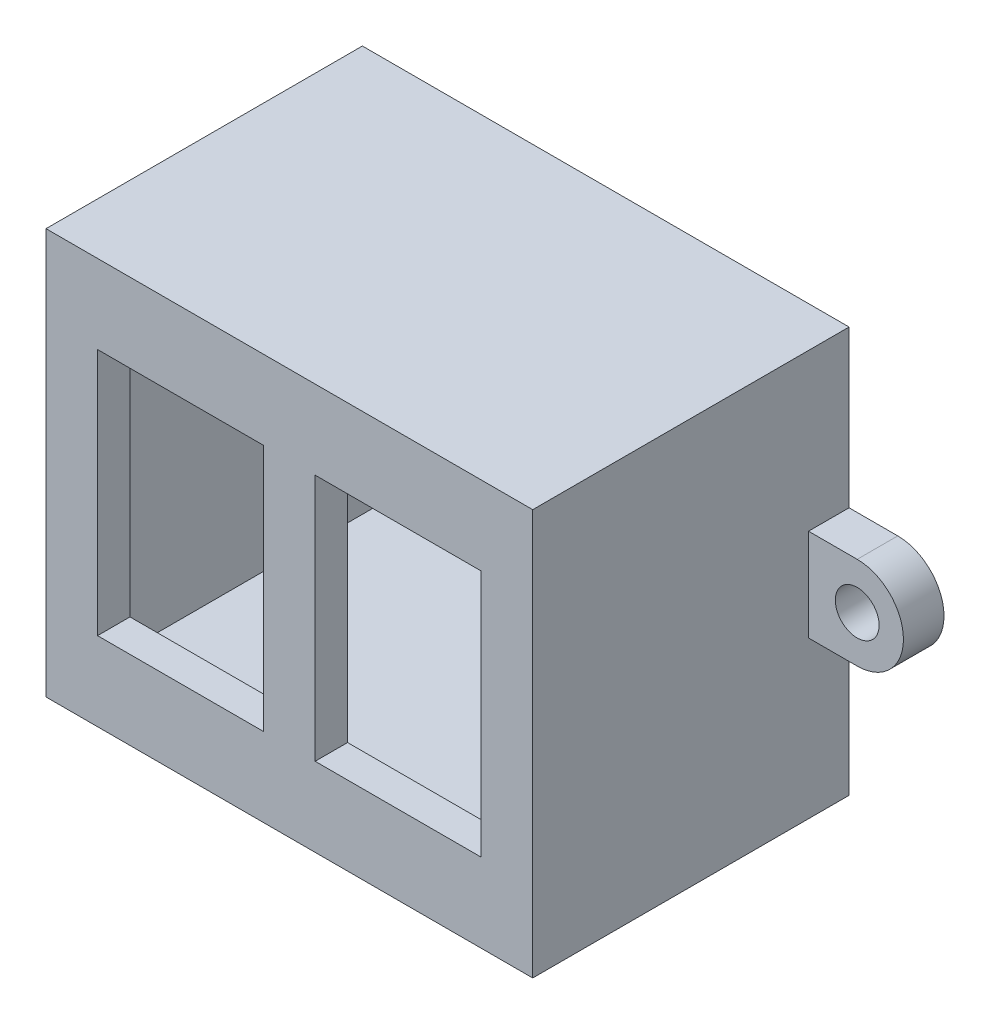
ISO-10303-21;
HEADER;
FILE_DESCRIPTION(('STEP AP214'),'2;1');
FILE_NAME('part.step','',(''),(''),'','','');
FILE_SCHEMA(('AUTOMOTIVE_DESIGN { 1 0 10303 214 1 1 1 1 }'));
ENDSEC;
DATA;
#1=APPLICATION_CONTEXT('core data for automotive mechanical design processes');
#2=APPLICATION_PROTOCOL_DEFINITION('international standard','automotive_design',2000,#1);
#3=PRODUCT_CONTEXT('',#1,'mechanical');
#4=PRODUCT('Part','Part','',(#3));
#5=PRODUCT_RELATED_PRODUCT_CATEGORY('part','',(#4));
#6=PRODUCT_DEFINITION_FORMATION('','',#4);
#7=PRODUCT_DEFINITION_CONTEXT('part definition',#1,'design');
#8=PRODUCT_DEFINITION('design','',#6,#7);
#9=PRODUCT_DEFINITION_SHAPE('','',#8);
#10=(LENGTH_UNIT() NAMED_UNIT(*) SI_UNIT(.MILLI.,.METRE.));
#11=(NAMED_UNIT(*) PLANE_ANGLE_UNIT() SI_UNIT($,.RADIAN.));
#12=(NAMED_UNIT(*) SI_UNIT($,.STERADIAN.) SOLID_ANGLE_UNIT());
#13=UNCERTAINTY_MEASURE_WITH_UNIT(LENGTH_MEASURE(1.E-05),#10,'distance_accuracy_value','');
#14=(GEOMETRIC_REPRESENTATION_CONTEXT(3) GLOBAL_UNCERTAINTY_ASSIGNED_CONTEXT((#13)) GLOBAL_UNIT_ASSIGNED_CONTEXT((#10,
#11,#12)) REPRESENTATION_CONTEXT('',''));
#15=CARTESIAN_POINT('',(0.,0.,0.));
#16=DIRECTION('',(0.,0.,1.));
#17=DIRECTION('',(1.,0.,0.));
#18=AXIS2_PLACEMENT_3D('',#15,#16,#17);
#19=CARTESIAN_POINT('',(0.,0.,2.54));
#20=DIRECTION('',(1.,0.,0.));
#21=DIRECTION('',(0.,0.,-1.));
#22=AXIS2_PLACEMENT_3D('',#19,#20,#21);
#23=PLANE('',#22);
#24=DIRECTION('',(0.,0.,-1.));
#25=VECTOR('',#24,1.);
#26=CARTESIAN_POINT('',(0.,19.4945,-19.05));
#27=LINE('',#26,#25);
#28=CARTESIAN_POINT('',(0.,19.4945,-19.05));
#29=VERTEX_POINT('',#28);
#30=CARTESIAN_POINT('',(0.,19.4945,-22.225));
#31=VERTEX_POINT('',#30);
#32=EDGE_CURVE('E310',#29,#31,#27,.T.);
#33=ORIENTED_EDGE('',*,*,#32,.F.);
#34=DIRECTION('',(0.,-1.,0.));
#35=VECTOR('',#34,1.);
#36=CARTESIAN_POINT('',(0.,12.2555,-19.05));
#37=LINE('',#36,#35);
#38=CARTESIAN_POINT('',(0.,12.2555,-19.05));
#39=VERTEX_POINT('',#38);
#40=EDGE_CURVE('E285',#29,#39,#37,.T.);
#41=ORIENTED_EDGE('',*,*,#40,.T.);
#42=DIRECTION('',(0.,0.,-1.));
#43=VECTOR('',#42,1.);
#44=CARTESIAN_POINT('',(0.,12.2555,-19.05));
#45=LINE('',#44,#43);
#46=CARTESIAN_POINT('',(0.,12.2555,-22.225));
#47=VERTEX_POINT('',#46);
#48=EDGE_CURVE('E307',#39,#47,#45,.T.);
#49=ORIENTED_EDGE('',*,*,#48,.T.);
#50=DIRECTION('',(0.,1.,0.));
#51=VECTOR('',#50,1.);
#52=CARTESIAN_POINT('',(0.,31.75,-22.225));
#53=LINE('',#52,#51);
#54=CARTESIAN_POINT('',(0.,0.,-22.225));
#55=VERTEX_POINT('',#54);
#56=EDGE_CURVE('E423',#55,#47,#53,.T.);
#57=ORIENTED_EDGE('',*,*,#56,.F.);
#58=DIRECTION('',(0.,0.,-1.));
#59=VECTOR('',#58,1.);
#60=CARTESIAN_POINT('',(0.,0.,2.54));
#61=LINE('',#60,#59);
#62=CARTESIAN_POINT('',(0.,0.,2.54));
#63=VERTEX_POINT('',#62);
#64=EDGE_CURVE('E11',#63,#55,#61,.T.);
#65=ORIENTED_EDGE('',*,*,#64,.F.);
#66=DIRECTION('',(0.,-1.,0.));
#67=VECTOR('',#66,1.);
#68=CARTESIAN_POINT('',(0.,0.,2.54));
#69=LINE('',#68,#67);
#70=CARTESIAN_POINT('',(0.,31.75,2.54));
#71=VERTEX_POINT('',#70);
#72=EDGE_CURVE('E513',#71,#63,#69,.T.);
#73=ORIENTED_EDGE('',*,*,#72,.F.);
#74=DIRECTION('',(0.,0.,-1.));
#75=VECTOR('',#74,1.);
#76=CARTESIAN_POINT('',(0.,31.75,2.54));
#77=LINE('',#76,#75);
#78=CARTESIAN_POINT('',(0.,31.75,-22.225));
#79=VERTEX_POINT('',#78);
#80=EDGE_CURVE('E526',#71,#79,#77,.T.);
#81=ORIENTED_EDGE('',*,*,#80,.T.);
#82=EDGE_CURVE('E422',#31,#79,#53,.T.);
#83=ORIENTED_EDGE('',*,*,#82,.F.);
#84=EDGE_LOOP('',(#33,#41,#49,#57,#65,#73,#81,#83));
#85=FACE_BOUND('',#84,.T.);
#86=ADVANCED_FACE('F39',(#85),#23,.F.);
#87=CARTESIAN_POINT('',(38.1,0.,2.54));
#88=DIRECTION('',(-1.,0.,0.));
#89=DIRECTION('',(0.,0.,1.));
#90=AXIS2_PLACEMENT_3D('',#87,#88,#89);
#91=PLANE('',#90);
#92=DIRECTION('',(0.,0.,-1.));
#93=VECTOR('',#92,1.);
#94=CARTESIAN_POINT('',(38.1,12.2555,-19.05));
#95=LINE('',#94,#93);
#96=CARTESIAN_POINT('',(38.1,12.2555,-19.05));
#97=VERTEX_POINT('',#96);
#98=CARTESIAN_POINT('',(38.1,12.2555,-22.225));
#99=VERTEX_POINT('',#98);
#100=EDGE_CURVE('E359',#97,#99,#95,.T.);
#101=ORIENTED_EDGE('',*,*,#100,.F.);
#102=DIRECTION('',(0.,1.,0.));
#103=VECTOR('',#102,1.);
#104=CARTESIAN_POINT('',(38.1,19.4945,-19.05));
#105=LINE('',#104,#103);
#106=CARTESIAN_POINT('',(38.1,19.4945,-19.05));
#107=VERTEX_POINT('',#106);
#108=EDGE_CURVE('E332',#97,#107,#105,.T.);
#109=ORIENTED_EDGE('',*,*,#108,.T.);
#110=DIRECTION('',(0.,0.,-1.));
#111=VECTOR('',#110,1.);
#112=CARTESIAN_POINT('',(38.1,19.4945,-19.05));
#113=LINE('',#112,#111);
#114=CARTESIAN_POINT('',(38.1,19.4945,-22.225));
#115=VERTEX_POINT('',#114);
#116=EDGE_CURVE('E355',#107,#115,#113,.T.);
#117=ORIENTED_EDGE('',*,*,#116,.T.);
#118=DIRECTION('',(0.,-1.,0.));
#119=VECTOR('',#118,1.);
#120=CARTESIAN_POINT('',(38.1,0.,-22.225));
#121=LINE('',#120,#119);
#122=CARTESIAN_POINT('',(38.1,31.75,-22.225));
#123=VERTEX_POINT('',#122);
#124=EDGE_CURVE('E414',#123,#115,#121,.T.);
#125=ORIENTED_EDGE('',*,*,#124,.F.);
#126=DIRECTION('',(0.,0.,-1.));
#127=VECTOR('',#126,1.);
#128=CARTESIAN_POINT('',(38.1,31.75,2.54));
#129=LINE('',#128,#127);
#130=CARTESIAN_POINT('',(38.1,31.75,2.54));
#131=VERTEX_POINT('',#130);
#132=EDGE_CURVE('E530',#131,#123,#129,.T.);
#133=ORIENTED_EDGE('',*,*,#132,.F.);
#134=DIRECTION('',(0.,1.,0.));
#135=VECTOR('',#134,1.);
#136=CARTESIAN_POINT('',(38.1,0.,2.54));
#137=LINE('',#136,#135);
#138=CARTESIAN_POINT('',(38.1,0.,2.54));
#139=VERTEX_POINT('',#138);
#140=EDGE_CURVE('E520',#139,#131,#137,.T.);
#141=ORIENTED_EDGE('',*,*,#140,.F.);
#142=DIRECTION('',(0.,0.,-1.));
#143=VECTOR('',#142,1.);
#144=CARTESIAN_POINT('',(38.1,0.,2.54));
#145=LINE('',#144,#143);
#146=CARTESIAN_POINT('',(38.1,0.,-22.225));
#147=VERTEX_POINT('',#146);
#148=EDGE_CURVE('E47',#139,#147,#145,.T.);
#149=ORIENTED_EDGE('',*,*,#148,.T.);
#150=EDGE_CURVE('E413',#99,#147,#121,.T.);
#151=ORIENTED_EDGE('',*,*,#150,.F.);
#152=EDGE_LOOP('',(#101,#109,#117,#125,#133,#141,#149,#151));
#153=FACE_BOUND('',#152,.T.);
#154=ADVANCED_FACE('F539',(#153),#91,.F.);
#155=CARTESIAN_POINT('',(0.,0.,0.));
#156=DIRECTION('',(0.,0.,-1.));
#157=DIRECTION('',(-1.,0.,0.));
#158=AXIS2_PLACEMENT_3D('',#155,#156,#157);
#159=PLANE('',#158);
#160=DIRECTION('',(-1.,0.,0.));
#161=VECTOR('',#160,1.);
#162=CARTESIAN_POINT('',(21.0666666666667,25.575,0.));
#163=LINE('',#162,#161);
#164=CARTESIAN_POINT('',(34.0666666666667,25.575,0.));
#165=VERTEX_POINT('',#164);
#166=CARTESIAN_POINT('',(21.0666666666667,25.575,0.));
#167=VERTEX_POINT('',#166);
#168=EDGE_CURVE('E432',#165,#167,#163,.T.);
#169=ORIENTED_EDGE('',*,*,#168,.T.);
#170=DIRECTION('',(0.,-1.,0.));
#171=VECTOR('',#170,1.);
#172=CARTESIAN_POINT('',(21.0666666666667,6.17500000000001,0.));
#173=LINE('',#172,#171);
#174=CARTESIAN_POINT('',(21.0666666666667,6.17500000000001,0.));
#175=VERTEX_POINT('',#174);
#176=EDGE_CURVE('E427',#167,#175,#173,.T.);
#177=ORIENTED_EDGE('',*,*,#176,.T.);
#178=DIRECTION('',(1.,0.,0.));
#179=VECTOR('',#178,1.);
#180=CARTESIAN_POINT('',(21.0666666666667,6.17500000000001,0.));
#181=LINE('',#180,#179);
#182=CARTESIAN_POINT('',(34.0666666666667,6.17500000000001,0.));
#183=VERTEX_POINT('',#182);
#184=EDGE_CURVE('E446',#175,#183,#181,.T.);
#185=ORIENTED_EDGE('',*,*,#184,.T.);
#186=DIRECTION('',(0.,1.,0.));
#187=VECTOR('',#186,1.);
#188=CARTESIAN_POINT('',(34.0666666666667,6.17500000000001,0.));
#189=LINE('',#188,#187);
#190=EDGE_CURVE('E450',#183,#165,#189,.T.);
#191=ORIENTED_EDGE('',*,*,#190,.T.);
#192=EDGE_LOOP('',(#169,#177,#185,#191));
#193=FACE_BOUND('',#192,.T.);
#194=DIRECTION('',(-1.,0.,0.));
#195=VECTOR('',#194,1.);
#196=CARTESIAN_POINT('',(4.03333333333334,25.575,0.));
#197=LINE('',#196,#195);
#198=CARTESIAN_POINT('',(17.0333333333333,25.575,0.));
#199=VERTEX_POINT('',#198);
#200=CARTESIAN_POINT('',(4.03333333333334,25.575,0.));
#201=VERTEX_POINT('',#200);
#202=EDGE_CURVE('E475',#199,#201,#197,.T.);
#203=ORIENTED_EDGE('',*,*,#202,.T.);
#204=DIRECTION('',(0.,-1.,0.));
#205=VECTOR('',#204,1.);
#206=CARTESIAN_POINT('',(4.03333333333334,6.175,0.));
#207=LINE('',#206,#205);
#208=CARTESIAN_POINT('',(4.03333333333334,6.175,0.));
#209=VERTEX_POINT('',#208);
#210=EDGE_CURVE('E470',#201,#209,#207,.T.);
#211=ORIENTED_EDGE('',*,*,#210,.T.);
#212=DIRECTION('',(1.,0.,0.));
#213=VECTOR('',#212,1.);
#214=CARTESIAN_POINT('',(4.03333333333334,6.175,0.));
#215=LINE('',#214,#213);
#216=CARTESIAN_POINT('',(17.0333333333333,6.175,0.));
#217=VERTEX_POINT('',#216);
#218=EDGE_CURVE('E489',#209,#217,#215,.T.);
#219=ORIENTED_EDGE('',*,*,#218,.T.);
#220=DIRECTION('',(0.,1.,0.));
#221=VECTOR('',#220,1.);
#222=CARTESIAN_POINT('',(17.0333333333333,6.175,0.));
#223=LINE('',#222,#221);
#224=EDGE_CURVE('E493',#217,#199,#223,.T.);
#225=ORIENTED_EDGE('',*,*,#224,.T.);
#226=EDGE_LOOP('',(#203,#211,#219,#225));
#227=FACE_BOUND('',#226,.T.);
#228=DIRECTION('',(1.,0.,0.));
#229=VECTOR('',#228,1.);
#230=CARTESIAN_POINT('',(35.56,29.21,0.));
#231=LINE('',#230,#229);
#232=CARTESIAN_POINT('',(2.54,29.21,0.));
#233=VERTEX_POINT('',#232);
#234=CARTESIAN_POINT('',(35.56,29.21,0.));
#235=VERTEX_POINT('',#234);
#236=EDGE_CURVE('E387',#233,#235,#231,.T.);
#237=ORIENTED_EDGE('',*,*,#236,.T.);
#238=DIRECTION('',(0.,-1.,0.));
#239=VECTOR('',#238,1.);
#240=CARTESIAN_POINT('',(35.56,2.54,0.));
#241=LINE('',#240,#239);
#242=CARTESIAN_POINT('',(35.56,2.54,0.));
#243=VERTEX_POINT('',#242);
#244=EDGE_CURVE('E391',#235,#243,#241,.T.);
#245=ORIENTED_EDGE('',*,*,#244,.T.);
#246=DIRECTION('',(-1.,0.,0.));
#247=VECTOR('',#246,1.);
#248=CARTESIAN_POINT('',(2.54,2.54,0.));
#249=LINE('',#248,#247);
#250=CARTESIAN_POINT('',(2.54,2.54,0.));
#251=VERTEX_POINT('',#250);
#252=EDGE_CURVE('E354',#243,#251,#249,.T.);
#253=ORIENTED_EDGE('',*,*,#252,.T.);
#254=DIRECTION('',(0.,1.,0.));
#255=VECTOR('',#254,1.);
#256=CARTESIAN_POINT('',(2.54,29.21,0.));
#257=LINE('',#256,#255);
#258=EDGE_CURVE('E383',#251,#233,#257,.T.);
#259=ORIENTED_EDGE('',*,*,#258,.T.);
#260=EDGE_LOOP('',(#237,#245,#253,#259));
#261=FACE_BOUND('',#260,.T.);
#262=ADVANCED_FACE('F563',(#193,#227,#261),#159,.T.);
#263=CARTESIAN_POINT('',(0.,0.,2.54));
#264=DIRECTION('',(0.,0.,-1.));
#265=DIRECTION('',(-1.,0.,0.));
#266=AXIS2_PLACEMENT_3D('',#263,#264,#265);
#267=PLANE('',#266);
#268=DIRECTION('',(0.,-1.,0.));
#269=VECTOR('',#268,1.);
#270=CARTESIAN_POINT('',(4.03333333333334,6.175,2.54));
#271=LINE('',#270,#269);
#272=CARTESIAN_POINT('',(4.03333333333334,25.575,2.54));
#273=VERTEX_POINT('',#272);
#274=CARTESIAN_POINT('',(4.03333333333334,6.175,2.54));
#275=VERTEX_POINT('',#274);
#276=EDGE_CURVE('E471',#273,#275,#271,.T.);
#277=ORIENTED_EDGE('',*,*,#276,.F.);
#278=DIRECTION('',(-1.,0.,0.));
#279=VECTOR('',#278,1.);
#280=CARTESIAN_POINT('',(4.03333333333334,25.575,2.54));
#281=LINE('',#280,#279);
#282=CARTESIAN_POINT('',(17.0333333333333,25.575,2.54));
#283=VERTEX_POINT('',#282);
#284=EDGE_CURVE('E482',#283,#273,#281,.T.);
#285=ORIENTED_EDGE('',*,*,#284,.F.);
#286=DIRECTION('',(0.,1.,0.));
#287=VECTOR('',#286,1.);
#288=CARTESIAN_POINT('',(17.0333333333333,6.175,2.54));
#289=LINE('',#288,#287);
#290=CARTESIAN_POINT('',(17.0333333333333,6.175,2.54));
#291=VERTEX_POINT('',#290);
#292=EDGE_CURVE('E478',#291,#283,#289,.T.);
#293=ORIENTED_EDGE('',*,*,#292,.F.);
#294=DIRECTION('',(1.,0.,0.));
#295=VECTOR('',#294,1.);
#296=CARTESIAN_POINT('',(4.03333333333334,6.175,2.54));
#297=LINE('',#296,#295);
#298=EDGE_CURVE('E474',#275,#291,#297,.T.);
#299=ORIENTED_EDGE('',*,*,#298,.F.);
#300=EDGE_LOOP('',(#277,#285,#293,#299));
#301=FACE_BOUND('',#300,.T.);
#302=ORIENTED_EDGE('',*,*,#72,.T.);
#303=DIRECTION('',(1.,0.,0.));
#304=VECTOR('',#303,1.);
#305=CARTESIAN_POINT('',(0.,0.,2.54));
#306=LINE('',#305,#304);
#307=EDGE_CURVE('E517',#63,#139,#306,.T.);
#308=ORIENTED_EDGE('',*,*,#307,.T.);
#309=ORIENTED_EDGE('',*,*,#140,.T.);
#310=DIRECTION('',(-1.,0.,0.));
#311=VECTOR('',#310,1.);
#312=CARTESIAN_POINT('',(0.,31.75,2.54));
#313=LINE('',#312,#311);
#314=EDGE_CURVE('E523',#131,#71,#313,.T.);
#315=ORIENTED_EDGE('',*,*,#314,.T.);
#316=EDGE_LOOP('',(#302,#308,#309,#315));
#317=FACE_BOUND('',#316,.T.);
#318=DIRECTION('',(0.,-1.,0.));
#319=VECTOR('',#318,1.);
#320=CARTESIAN_POINT('',(21.0666666666667,6.17500000000001,2.54));
#321=LINE('',#320,#319);
#322=CARTESIAN_POINT('',(21.0666666666667,25.575,2.54));
#323=VERTEX_POINT('',#322);
#324=CARTESIAN_POINT('',(21.0666666666667,6.17500000000001,2.54));
#325=VERTEX_POINT('',#324);
#326=EDGE_CURVE('E428',#323,#325,#321,.T.);
#327=ORIENTED_EDGE('',*,*,#326,.F.);
#328=DIRECTION('',(-1.,0.,0.));
#329=VECTOR('',#328,1.);
#330=CARTESIAN_POINT('',(21.0666666666667,25.575,2.54));
#331=LINE('',#330,#329);
#332=CARTESIAN_POINT('',(34.0666666666667,25.575,2.54));
#333=VERTEX_POINT('',#332);
#334=EDGE_CURVE('E439',#333,#323,#331,.T.);
#335=ORIENTED_EDGE('',*,*,#334,.F.);
#336=DIRECTION('',(0.,1.,0.));
#337=VECTOR('',#336,1.);
#338=CARTESIAN_POINT('',(34.0666666666667,6.17500000000001,2.54));
#339=LINE('',#338,#337);
#340=CARTESIAN_POINT('',(34.0666666666667,6.17500000000001,2.54));
#341=VERTEX_POINT('',#340);
#342=EDGE_CURVE('E435',#341,#333,#339,.T.);
#343=ORIENTED_EDGE('',*,*,#342,.F.);
#344=DIRECTION('',(1.,0.,0.));
#345=VECTOR('',#344,1.);
#346=CARTESIAN_POINT('',(21.0666666666667,6.17500000000001,2.54));
#347=LINE('',#346,#345);
#348=EDGE_CURVE('E431',#325,#341,#347,.T.);
#349=ORIENTED_EDGE('',*,*,#348,.F.);
#350=EDGE_LOOP('',(#327,#335,#343,#349));
#351=FACE_BOUND('',#350,.T.);
#352=ADVANCED_FACE('F604',(#301,#317,#351),#267,.F.);
#353=CARTESIAN_POINT('',(0.,0.,2.54));
#354=DIRECTION('',(0.,1.,0.));
#355=DIRECTION('',(0.,0.,1.));
#356=AXIS2_PLACEMENT_3D('',#353,#354,#355);
#357=PLANE('',#356);
#358=CARTESIAN_POINT('',(19.05,0.,-19.05));
#359=DIRECTION('',(0.,-1.,0.));
#360=DIRECTION('',(0.,0.,-1.));
#361=AXIS2_PLACEMENT_3D('',#358,#359,#360);
#362=CIRCLE('',#361,3.175);
#363=CARTESIAN_POINT('',(22.225,0.,-19.05));
#364=VERTEX_POINT('',#363);
#365=CARTESIAN_POINT('',(15.875,0.,-19.05));
#366=VERTEX_POINT('',#365);
#367=EDGE_CURVE('E229',#364,#366,#362,.T.);
#368=ORIENTED_EDGE('',*,*,#367,.F.);
#369=DIRECTION('',(0.,0.,1.));
#370=VECTOR('',#369,1.);
#371=CARTESIAN_POINT('',(22.225,0.,-19.05));
#372=LINE('',#371,#370);
#373=CARTESIAN_POINT('',(22.225,0.,-22.225));
#374=VERTEX_POINT('',#373);
#375=EDGE_CURVE('E240',#374,#364,#372,.T.);
#376=ORIENTED_EDGE('',*,*,#375,.F.);
#377=DIRECTION('',(-1.,0.,0.));
#378=VECTOR('',#377,1.);
#379=CARTESIAN_POINT('',(0.,0.,-22.225));
#380=LINE('',#379,#378);
#381=EDGE_CURVE('E419',#147,#374,#380,.T.);
#382=ORIENTED_EDGE('',*,*,#381,.F.);
#383=ORIENTED_EDGE('',*,*,#148,.F.);
#384=ORIENTED_EDGE('',*,*,#307,.F.);
#385=ORIENTED_EDGE('',*,*,#64,.T.);
#386=CARTESIAN_POINT('',(15.875,0.,-22.225));
#387=VERTEX_POINT('',#386);
#388=EDGE_CURVE('E418',#387,#55,#380,.T.);
#389=ORIENTED_EDGE('',*,*,#388,.F.);
#390=DIRECTION('',(0.,0.,-1.));
#391=VECTOR('',#390,1.);
#392=CARTESIAN_POINT('',(15.875,0.,-22.225));
#393=LINE('',#392,#391);
#394=EDGE_CURVE('E248',#366,#387,#393,.T.);
#395=ORIENTED_EDGE('',*,*,#394,.F.);
#396=EDGE_LOOP('',(#368,#376,#382,#383,#384,#385,#389,#395));
#397=FACE_BOUND('',#396,.T.);
#398=ADVANCED_FACE('F250',(#397),#357,.F.);
#399=CARTESIAN_POINT('',(0.,31.75,2.54));
#400=DIRECTION('',(0.,-1.,0.));
#401=DIRECTION('',(0.,0.,-1.));
#402=AXIS2_PLACEMENT_3D('',#399,#400,#401);
#403=PLANE('',#402);
#404=ORIENTED_EDGE('',*,*,#132,.T.);
#405=DIRECTION('',(1.,0.,0.));
#406=VECTOR('',#405,1.);
#407=CARTESIAN_POINT('',(38.1,31.75,-22.225));
#408=LINE('',#407,#406);
#409=EDGE_CURVE('E409',#79,#123,#408,.T.);
#410=ORIENTED_EDGE('',*,*,#409,.F.);
#411=ORIENTED_EDGE('',*,*,#80,.F.);
#412=ORIENTED_EDGE('',*,*,#314,.F.);
#413=EDGE_LOOP('',(#404,#410,#411,#412));
#414=FACE_BOUND('',#413,.T.);
#415=ADVANCED_FACE('F608',(#414),#403,.F.);
#416=CARTESIAN_POINT('',(4.03333333333334,6.175,2.54));
#417=DIRECTION('',(1.,0.,0.));
#418=DIRECTION('',(0.,1.,0.));
#419=AXIS2_PLACEMENT_3D('',#416,#417,#418);
#420=PLANE('',#419);
#421=ORIENTED_EDGE('',*,*,#210,.F.);
#422=DIRECTION('',(0.,0.,-1.));
#423=VECTOR('',#422,1.);
#424=CARTESIAN_POINT('',(4.03333333333334,25.575,2.54));
#425=LINE('',#424,#423);
#426=EDGE_CURVE('E485',#273,#201,#425,.T.);
#427=ORIENTED_EDGE('',*,*,#426,.F.);
#428=ORIENTED_EDGE('',*,*,#276,.T.);
#429=DIRECTION('',(0.,0.,-1.));
#430=VECTOR('',#429,1.);
#431=CARTESIAN_POINT('',(4.03333333333334,6.175,2.54));
#432=LINE('',#431,#430);
#433=EDGE_CURVE('E509',#275,#209,#432,.T.);
#434=ORIENTED_EDGE('',*,*,#433,.T.);
#435=EDGE_LOOP('',(#421,#427,#428,#434));
#436=FACE_BOUND('',#435,.T.);
#437=ADVANCED_FACE('F754',(#436),#420,.T.);
#438=CARTESIAN_POINT('',(4.03333333333334,6.175,2.54));
#439=DIRECTION('',(0.,1.,0.));
#440=DIRECTION('',(0.,0.,1.));
#441=AXIS2_PLACEMENT_3D('',#438,#439,#440);
#442=PLANE('',#441);
#443=ORIENTED_EDGE('',*,*,#218,.F.);
#444=ORIENTED_EDGE('',*,*,#433,.F.);
#445=ORIENTED_EDGE('',*,*,#298,.T.);
#446=DIRECTION('',(0.,0.,-1.));
#447=VECTOR('',#446,1.);
#448=CARTESIAN_POINT('',(17.0333333333333,6.175,2.54));
#449=LINE('',#448,#447);
#450=EDGE_CURVE('E506',#291,#217,#449,.T.);
#451=ORIENTED_EDGE('',*,*,#450,.T.);
#452=EDGE_LOOP('',(#443,#444,#445,#451));
#453=FACE_BOUND('',#452,.T.);
#454=ADVANCED_FACE('F829',(#453),#442,.T.);
#455=CARTESIAN_POINT('',(17.0333333333333,6.175,2.54));
#456=DIRECTION('',(-1.,0.,0.));
#457=DIRECTION('',(0.,-1.,0.));
#458=AXIS2_PLACEMENT_3D('',#455,#456,#457);
#459=PLANE('',#458);
#460=ORIENTED_EDGE('',*,*,#224,.F.);
#461=ORIENTED_EDGE('',*,*,#450,.F.);
#462=ORIENTED_EDGE('',*,*,#292,.T.);
#463=DIRECTION('',(0.,0.,-1.));
#464=VECTOR('',#463,1.);
#465=CARTESIAN_POINT('',(17.0333333333333,25.575,2.54));
#466=LINE('',#465,#464);
#467=EDGE_CURVE('E503',#283,#199,#466,.T.);
#468=ORIENTED_EDGE('',*,*,#467,.T.);
#469=EDGE_LOOP('',(#460,#461,#462,#468));
#470=FACE_BOUND('',#469,.T.);
#471=ADVANCED_FACE('F819',(#470),#459,.T.);
#472=CARTESIAN_POINT('',(4.03333333333334,25.575,2.54));
#473=DIRECTION('',(0.,-1.,0.));
#474=DIRECTION('',(0.,0.,-1.));
#475=AXIS2_PLACEMENT_3D('',#472,#473,#474);
#476=PLANE('',#475);
#477=ORIENTED_EDGE('',*,*,#202,.F.);
#478=ORIENTED_EDGE('',*,*,#467,.F.);
#479=ORIENTED_EDGE('',*,*,#284,.T.);
#480=ORIENTED_EDGE('',*,*,#426,.T.);
#481=EDGE_LOOP('',(#477,#478,#479,#480));
#482=FACE_BOUND('',#481,.T.);
#483=ADVANCED_FACE('F809',(#482),#476,.T.);
#484=CARTESIAN_POINT('',(21.0666666666667,6.17500000000001,2.54));
#485=DIRECTION('',(1.,0.,0.));
#486=DIRECTION('',(0.,0.,-1.));
#487=AXIS2_PLACEMENT_3D('',#484,#485,#486);
#488=PLANE('',#487);
#489=ORIENTED_EDGE('',*,*,#176,.F.);
#490=DIRECTION('',(0.,0.,-1.));
#491=VECTOR('',#490,1.);
#492=CARTESIAN_POINT('',(21.0666666666667,25.575,2.54));
#493=LINE('',#492,#491);
#494=EDGE_CURVE('E442',#323,#167,#493,.T.);
#495=ORIENTED_EDGE('',*,*,#494,.F.);
#496=ORIENTED_EDGE('',*,*,#326,.T.);
#497=DIRECTION('',(0.,0.,-1.));
#498=VECTOR('',#497,1.);
#499=CARTESIAN_POINT('',(21.0666666666667,6.17500000000001,2.54));
#500=LINE('',#499,#498);
#501=EDGE_CURVE('E466',#325,#175,#500,.T.);
#502=ORIENTED_EDGE('',*,*,#501,.T.);
#503=EDGE_LOOP('',(#489,#495,#496,#502));
#504=FACE_BOUND('',#503,.T.);
#505=ADVANCED_FACE('F799',(#504),#488,.T.);
#506=CARTESIAN_POINT('',(21.0666666666667,6.17500000000001,2.54));
#507=DIRECTION('',(0.,1.,0.));
#508=DIRECTION('',(0.,0.,1.));
#509=AXIS2_PLACEMENT_3D('',#506,#507,#508);
#510=PLANE('',#509);
#511=ORIENTED_EDGE('',*,*,#184,.F.);
#512=ORIENTED_EDGE('',*,*,#501,.F.);
#513=ORIENTED_EDGE('',*,*,#348,.T.);
#514=DIRECTION('',(0.,0.,-1.));
#515=VECTOR('',#514,1.);
#516=CARTESIAN_POINT('',(34.0666666666667,6.17500000000001,2.54));
#517=LINE('',#516,#515);
#518=EDGE_CURVE('E463',#341,#183,#517,.T.);
#519=ORIENTED_EDGE('',*,*,#518,.T.);
#520=EDGE_LOOP('',(#511,#512,#513,#519));
#521=FACE_BOUND('',#520,.T.);
#522=ADVANCED_FACE('F789',(#521),#510,.T.);
#523=CARTESIAN_POINT('',(34.0666666666667,6.17500000000001,2.54));
#524=DIRECTION('',(-1.,0.,0.));
#525=DIRECTION('',(0.,0.,1.));
#526=AXIS2_PLACEMENT_3D('',#523,#524,#525);
#527=PLANE('',#526);
#528=ORIENTED_EDGE('',*,*,#190,.F.);
#529=ORIENTED_EDGE('',*,*,#518,.F.);
#530=ORIENTED_EDGE('',*,*,#342,.T.);
#531=DIRECTION('',(0.,0.,-1.));
#532=VECTOR('',#531,1.);
#533=CARTESIAN_POINT('',(34.0666666666667,25.575,2.54));
#534=LINE('',#533,#532);
#535=EDGE_CURVE('E460',#333,#165,#534,.T.);
#536=ORIENTED_EDGE('',*,*,#535,.T.);
#537=EDGE_LOOP('',(#528,#529,#530,#536));
#538=FACE_BOUND('',#537,.T.);
#539=ADVANCED_FACE('F778',(#538),#527,.T.);
#540=CARTESIAN_POINT('',(21.0666666666667,25.575,2.54));
#541=DIRECTION('',(0.,-1.,0.));
#542=DIRECTION('',(1.,0.,0.));
#543=AXIS2_PLACEMENT_3D('',#540,#541,#542);
#544=PLANE('',#543);
#545=ORIENTED_EDGE('',*,*,#168,.F.);
#546=ORIENTED_EDGE('',*,*,#535,.F.);
#547=ORIENTED_EDGE('',*,*,#334,.T.);
#548=ORIENTED_EDGE('',*,*,#494,.T.);
#549=EDGE_LOOP('',(#545,#546,#547,#548));
#550=FACE_BOUND('',#549,.T.);
#551=ADVANCED_FACE('F774',(#550),#544,.T.);
#552=CARTESIAN_POINT('',(0.,0.,-22.225));
#553=DIRECTION('',(0.,0.,1.));
#554=DIRECTION('',(1.,0.,0.));
#555=AXIS2_PLACEMENT_3D('',#552,#553,#554);
#556=PLANE('',#555);
#557=ORIENTED_EDGE('',*,*,#381,.T.);
#558=DIRECTION('',(0.,-1.,0.));
#559=VECTOR('',#558,1.);
#560=CARTESIAN_POINT('',(22.225,31.751,-22.225));
#561=LINE('',#560,#559);
#562=CARTESIAN_POINT('',(22.225,2.54,-22.225));
#563=VERTEX_POINT('',#562);
#564=EDGE_CURVE('E236',#563,#374,#561,.T.);
#565=ORIENTED_EDGE('',*,*,#564,.F.);
#566=DIRECTION('',(-1.,0.,0.));
#567=VECTOR('',#566,1.);
#568=CARTESIAN_POINT('',(2.54,2.54,-22.225));
#569=LINE('',#568,#567);
#570=CARTESIAN_POINT('',(35.56,2.54,-22.225));
#571=VERTEX_POINT('',#570);
#572=EDGE_CURVE('E364',#571,#563,#569,.T.);
#573=ORIENTED_EDGE('',*,*,#572,.F.);
#574=DIRECTION('',(0.,-1.,0.));
#575=VECTOR('',#574,1.);
#576=CARTESIAN_POINT('',(35.56,2.54,-22.225));
#577=LINE('',#576,#575);
#578=CARTESIAN_POINT('',(35.56,29.21,-22.225));
#579=VERTEX_POINT('',#578);
#580=EDGE_CURVE('E376',#579,#571,#577,.T.);
#581=ORIENTED_EDGE('',*,*,#580,.F.);
#582=DIRECTION('',(1.,0.,0.));
#583=VECTOR('',#582,1.);
#584=CARTESIAN_POINT('',(35.56,29.21,-22.225));
#585=LINE('',#584,#583);
#586=CARTESIAN_POINT('',(2.54,29.21,-22.225));
#587=VERTEX_POINT('',#586);
#588=EDGE_CURVE('E372',#587,#579,#585,.T.);
#589=ORIENTED_EDGE('',*,*,#588,.F.);
#590=DIRECTION('',(0.,1.,0.));
#591=VECTOR('',#590,1.);
#592=CARTESIAN_POINT('',(2.54,29.21,-22.225));
#593=LINE('',#592,#591);
#594=CARTESIAN_POINT('',(2.54,2.54,-22.225));
#595=VERTEX_POINT('',#594);
#596=EDGE_CURVE('E368',#595,#587,#593,.T.);
#597=ORIENTED_EDGE('',*,*,#596,.F.);
#598=CARTESIAN_POINT('',(15.875,2.54,-22.225));
#599=VERTEX_POINT('',#598);
#600=EDGE_CURVE('E369',#599,#595,#569,.T.);
#601=ORIENTED_EDGE('',*,*,#600,.F.);
#602=DIRECTION('',(0.,-1.,0.));
#603=VECTOR('',#602,1.);
#604=CARTESIAN_POINT('',(15.875,31.751,-22.225));
#605=LINE('',#604,#603);
#606=EDGE_CURVE('E54',#599,#387,#605,.T.);
#607=ORIENTED_EDGE('',*,*,#606,.T.);
#608=ORIENTED_EDGE('',*,*,#388,.T.);
#609=ORIENTED_EDGE('',*,*,#56,.T.);
#610=DIRECTION('',(-1.,0.,0.));
#611=VECTOR('',#610,1.);
#612=CARTESIAN_POINT('',(-3.81,12.2555,-22.225));
#613=LINE('',#612,#611);
#614=CARTESIAN_POINT('',(-3.81,12.2555,-22.225));
#615=VERTEX_POINT('',#614);
#616=EDGE_CURVE('E62',#47,#615,#613,.T.);
#617=ORIENTED_EDGE('',*,*,#616,.T.);
#618=CARTESIAN_POINT('',(-3.81,15.875,-22.225));
#619=DIRECTION('',(0.,0.,-1.));
#620=DIRECTION('',(-1.,0.,0.));
#621=AXIS2_PLACEMENT_3D('',#618,#619,#620);
#622=CIRCLE('',#621,3.6195);
#623=CARTESIAN_POINT('',(-3.81,19.4945,-22.225));
#624=VERTEX_POINT('',#623);
#625=EDGE_CURVE('E273',#615,#624,#622,.T.);
#626=ORIENTED_EDGE('',*,*,#625,.T.);
#627=DIRECTION('',(1.,0.,0.));
#628=VECTOR('',#627,1.);
#629=CARTESIAN_POINT('',(0.,19.4945,-22.225));
#630=LINE('',#629,#628);
#631=EDGE_CURVE('E297',#624,#31,#630,.T.);
#632=ORIENTED_EDGE('',*,*,#631,.T.);
#633=ORIENTED_EDGE('',*,*,#82,.T.);
#634=ORIENTED_EDGE('',*,*,#409,.T.);
#635=ORIENTED_EDGE('',*,*,#124,.T.);
#636=DIRECTION('',(1.,0.,0.));
#637=VECTOR('',#636,1.);
#638=CARTESIAN_POINT('',(41.91,19.4945,-22.225));
#639=LINE('',#638,#637);
#640=CARTESIAN_POINT('',(41.91,19.4945,-22.225));
#641=VERTEX_POINT('',#640);
#642=EDGE_CURVE('E328',#115,#641,#639,.T.);
#643=ORIENTED_EDGE('',*,*,#642,.T.);
#644=CARTESIAN_POINT('',(41.91,15.875,-22.225));
#645=DIRECTION('',(0.,0.,-1.));
#646=DIRECTION('',(-1.,0.,0.));
#647=AXIS2_PLACEMENT_3D('',#644,#645,#646);
#648=CIRCLE('',#647,3.6195);
#649=CARTESIAN_POINT('',(41.91,12.2555,-22.225));
#650=VERTEX_POINT('',#649);
#651=EDGE_CURVE('E319',#641,#650,#648,.T.);
#652=ORIENTED_EDGE('',*,*,#651,.T.);
#653=DIRECTION('',(-1.,0.,0.));
#654=VECTOR('',#653,1.);
#655=CARTESIAN_POINT('',(38.1,12.2555,-22.225));
#656=LINE('',#655,#654);
#657=EDGE_CURVE('E344',#650,#99,#656,.T.);
#658=ORIENTED_EDGE('',*,*,#657,.T.);
#659=ORIENTED_EDGE('',*,*,#150,.T.);
#660=EDGE_LOOP('',(#557,#565,#573,#581,#589,#597,#601,#607,#608,#609,#617,#626,#632,#633,#634,
#635,#643,#652,#658,#659));
#661=FACE_BOUND('',#660,.T.);
#662=CARTESIAN_POINT('',(41.91,15.875,-22.225));
#663=DIRECTION('',(0.,0.,-1.));
#664=DIRECTION('',(-1.,0.,0.));
#665=AXIS2_PLACEMENT_3D('',#662,#663,#664);
#666=CIRCLE('',#665,1.7145);
#667=CARTESIAN_POINT('',(40.1955,15.875,-22.225));
#668=VERTEX_POINT('',#667);
#669=EDGE_CURVE('E306',#668,#668,#666,.T.);
#670=ORIENTED_EDGE('',*,*,#669,.F.);
#671=EDGE_LOOP('',(#670));
#672=FACE_BOUND('',#671,.T.);
#673=CARTESIAN_POINT('',(-3.81,15.875,-22.225));
#674=DIRECTION('',(0.,0.,-1.));
#675=DIRECTION('',(-1.,0.,0.));
#676=AXIS2_PLACEMENT_3D('',#673,#674,#675);
#677=CIRCLE('',#676,1.7145);
#678=CARTESIAN_POINT('',(-5.5245,15.875,-22.225));
#679=VERTEX_POINT('',#678);
#680=EDGE_CURVE('E247',#679,#679,#677,.T.);
#681=ORIENTED_EDGE('',*,*,#680,.F.);
#682=EDGE_LOOP('',(#681));
#683=FACE_BOUND('',#682,.T.);
#684=ADVANCED_FACE('F542',(#661,#672,#683),#556,.F.);
#685=CARTESIAN_POINT('',(2.54,2.54,-22.225));
#686=DIRECTION('',(0.,1.,0.));
#687=DIRECTION('',(0.,0.,1.));
#688=AXIS2_PLACEMENT_3D('',#685,#686,#687);
#689=PLANE('',#688);
#690=DIRECTION('',(0.,0.,1.));
#691=VECTOR('',#690,1.);
#692=CARTESIAN_POINT('',(22.225,2.54,-19.05));
#693=LINE('',#692,#691);
#694=CARTESIAN_POINT('',(22.225,2.54,-19.05));
#695=VERTEX_POINT('',#694);
#696=EDGE_CURVE('E237',#563,#695,#693,.T.);
#697=ORIENTED_EDGE('',*,*,#696,.T.);
#698=CARTESIAN_POINT('',(19.05,2.54,-19.05));
#699=DIRECTION('',(0.,1.,0.));
#700=DIRECTION('',(0.,0.,1.));
#701=AXIS2_PLACEMENT_3D('',#698,#699,#700);
#702=CIRCLE('',#701,3.175);
#703=CARTESIAN_POINT('',(15.875,2.54,-19.05));
#704=VERTEX_POINT('',#703);
#705=EDGE_CURVE('E232',#695,#704,#702,.F.);
#706=ORIENTED_EDGE('',*,*,#705,.T.);
#707=DIRECTION('',(0.,0.,-1.));
#708=VECTOR('',#707,1.);
#709=CARTESIAN_POINT('',(15.875,2.54,-22.225));
#710=LINE('',#709,#708);
#711=EDGE_CURVE('E257',#704,#599,#710,.T.);
#712=ORIENTED_EDGE('',*,*,#711,.T.);
#713=ORIENTED_EDGE('',*,*,#600,.T.);
#714=DIRECTION('',(0.,0.,1.));
#715=VECTOR('',#714,1.);
#716=CARTESIAN_POINT('',(2.54,2.54,-22.225));
#717=LINE('',#716,#715);
#718=EDGE_CURVE('E405',#595,#251,#717,.T.);
#719=ORIENTED_EDGE('',*,*,#718,.T.);
#720=ORIENTED_EDGE('',*,*,#252,.F.);
#721=DIRECTION('',(0.,0.,1.));
#722=VECTOR('',#721,1.);
#723=CARTESIAN_POINT('',(35.56,2.54,-22.225));
#724=LINE('',#723,#722);
#725=EDGE_CURVE('E379',#571,#243,#724,.T.);
#726=ORIENTED_EDGE('',*,*,#725,.F.);
#727=ORIENTED_EDGE('',*,*,#572,.T.);
#728=EDGE_LOOP('',(#697,#706,#712,#713,#719,#720,#726,#727));
#729=FACE_BOUND('',#728,.T.);
#730=ADVANCED_FACE('F552',(#729),#689,.T.);
#731=CARTESIAN_POINT('',(2.54,29.21,-22.225));
#732=DIRECTION('',(1.,0.,0.));
#733=DIRECTION('',(0.,0.,-1.));
#734=AXIS2_PLACEMENT_3D('',#731,#732,#733);
#735=PLANE('',#734);
#736=ORIENTED_EDGE('',*,*,#258,.F.);
#737=ORIENTED_EDGE('',*,*,#718,.F.);
#738=ORIENTED_EDGE('',*,*,#596,.T.);
#739=DIRECTION('',(0.,0.,1.));
#740=VECTOR('',#739,1.);
#741=CARTESIAN_POINT('',(2.54,29.21,-22.225));
#742=LINE('',#741,#740);
#743=EDGE_CURVE('E402',#587,#233,#742,.T.);
#744=ORIENTED_EDGE('',*,*,#743,.T.);
#745=EDGE_LOOP('',(#736,#737,#738,#744));
#746=FACE_BOUND('',#745,.T.);
#747=ADVANCED_FACE('F555',(#746),#735,.T.);
#748=CARTESIAN_POINT('',(35.56,29.21,-22.225));
#749=DIRECTION('',(0.,-1.,0.));
#750=DIRECTION('',(0.,0.,-1.));
#751=AXIS2_PLACEMENT_3D('',#748,#749,#750);
#752=PLANE('',#751);
#753=ORIENTED_EDGE('',*,*,#236,.F.);
#754=ORIENTED_EDGE('',*,*,#743,.F.);
#755=ORIENTED_EDGE('',*,*,#588,.T.);
#756=DIRECTION('',(0.,0.,1.));
#757=VECTOR('',#756,1.);
#758=CARTESIAN_POINT('',(35.56,29.21,-22.225));
#759=LINE('',#758,#757);
#760=EDGE_CURVE('E398',#579,#235,#759,.T.);
#761=ORIENTED_EDGE('',*,*,#760,.T.);
#762=EDGE_LOOP('',(#753,#754,#755,#761));
#763=FACE_BOUND('',#762,.T.);
#764=ADVANCED_FACE('F561',(#763),#752,.T.);
#765=CARTESIAN_POINT('',(35.56,2.54,-22.225));
#766=DIRECTION('',(-1.,0.,0.));
#767=DIRECTION('',(0.,0.,1.));
#768=AXIS2_PLACEMENT_3D('',#765,#766,#767);
#769=PLANE('',#768);
#770=ORIENTED_EDGE('',*,*,#244,.F.);
#771=ORIENTED_EDGE('',*,*,#760,.F.);
#772=ORIENTED_EDGE('',*,*,#580,.T.);
#773=ORIENTED_EDGE('',*,*,#725,.T.);
#774=EDGE_LOOP('',(#770,#771,#772,#773));
#775=FACE_BOUND('',#774,.T.);
#776=ADVANCED_FACE('F566',(#775),#769,.T.);
#777=CARTESIAN_POINT('',(41.91,15.875,-19.05));
#778=DIRECTION('',(0.,0.,-1.));
#779=DIRECTION('',(-1.,0.,0.));
#780=AXIS2_PLACEMENT_3D('',#777,#778,#779);
#781=CYLINDRICAL_SURFACE('',#780,3.6195);
#782=ORIENTED_EDGE('',*,*,#651,.F.);
#783=DIRECTION('',(0.,0.,-1.));
#784=VECTOR('',#783,1.);
#785=CARTESIAN_POINT('',(41.91,19.4945,-19.05));
#786=LINE('',#785,#784);
#787=CARTESIAN_POINT('',(41.91,19.4945,-19.05));
#788=VERTEX_POINT('',#787);
#789=EDGE_CURVE('E351',#788,#641,#786,.T.);
#790=ORIENTED_EDGE('',*,*,#789,.F.);
#791=CARTESIAN_POINT('',(41.91,15.875,-19.05));
#792=DIRECTION('',(0.,0.,-1.));
#793=DIRECTION('',(-1.,0.,0.));
#794=AXIS2_PLACEMENT_3D('',#791,#792,#793);
#795=CIRCLE('',#794,3.6195);
#796=CARTESIAN_POINT('',(41.91,12.2555,-19.05));
#797=VERTEX_POINT('',#796);
#798=EDGE_CURVE('E323',#788,#797,#795,.T.);
#799=ORIENTED_EDGE('',*,*,#798,.T.);
#800=DIRECTION('',(0.,0.,-1.));
#801=VECTOR('',#800,1.);
#802=CARTESIAN_POINT('',(41.91,12.2555,-19.05));
#803=LINE('',#802,#801);
#804=EDGE_CURVE('E340',#797,#650,#803,.T.);
#805=ORIENTED_EDGE('',*,*,#804,.T.);
#806=EDGE_LOOP('',(#782,#790,#799,#805));
#807=FACE_BOUND('',#806,.T.);
#808=ADVANCED_FACE('F568',(#807),#781,.T.);
#809=CARTESIAN_POINT('',(41.91,19.4945,-19.05));
#810=DIRECTION('',(0.,1.,0.));
#811=DIRECTION('',(0.,0.,1.));
#812=AXIS2_PLACEMENT_3D('',#809,#810,#811);
#813=PLANE('',#812);
#814=ORIENTED_EDGE('',*,*,#642,.F.);
#815=ORIENTED_EDGE('',*,*,#116,.F.);
#816=DIRECTION('',(1.,0.,0.));
#817=VECTOR('',#816,1.);
#818=CARTESIAN_POINT('',(41.91,19.4945,-19.05));
#819=LINE('',#818,#817);
#820=EDGE_CURVE('E336',#107,#788,#819,.T.);
#821=ORIENTED_EDGE('',*,*,#820,.T.);
#822=ORIENTED_EDGE('',*,*,#789,.T.);
#823=EDGE_LOOP('',(#814,#815,#821,#822));
#824=FACE_BOUND('',#823,.T.);
#825=ADVANCED_FACE('F574',(#824),#813,.T.);
#826=CARTESIAN_POINT('',(38.1,12.2555,-19.05));
#827=DIRECTION('',(0.,-1.,0.));
#828=DIRECTION('',(1.,0.,0.));
#829=AXIS2_PLACEMENT_3D('',#826,#827,#828);
#830=PLANE('',#829);
#831=ORIENTED_EDGE('',*,*,#657,.F.);
#832=ORIENTED_EDGE('',*,*,#804,.F.);
#833=DIRECTION('',(-1.,0.,0.));
#834=VECTOR('',#833,1.);
#835=CARTESIAN_POINT('',(38.1,12.2555,-19.05));
#836=LINE('',#835,#834);
#837=EDGE_CURVE('E327',#797,#97,#836,.T.);
#838=ORIENTED_EDGE('',*,*,#837,.T.);
#839=ORIENTED_EDGE('',*,*,#100,.T.);
#840=EDGE_LOOP('',(#831,#832,#838,#839));
#841=FACE_BOUND('',#840,.T.);
#842=ADVANCED_FACE('F618',(#841),#830,.T.);
#843=CARTESIAN_POINT('',(41.91,15.875,-19.05));
#844=DIRECTION('',(0.,0.,-1.));
#845=DIRECTION('',(-1.,0.,0.));
#846=AXIS2_PLACEMENT_3D('',#843,#844,#845);
#847=PLANE('',#846);
#848=CARTESIAN_POINT('',(41.91,15.875,-19.05));
#849=DIRECTION('',(0.,0.,-1.));
#850=DIRECTION('',(-1.,0.,0.));
#851=AXIS2_PLACEMENT_3D('',#848,#849,#850);
#852=CIRCLE('',#851,1.7145);
#853=CARTESIAN_POINT('',(40.1955,15.875,-19.05));
#854=VERTEX_POINT('',#853);
#855=EDGE_CURVE('E315',#854,#854,#852,.T.);
#856=ORIENTED_EDGE('',*,*,#855,.T.);
#857=EDGE_LOOP('',(#856));
#858=FACE_BOUND('',#857,.T.);
#859=ORIENTED_EDGE('',*,*,#798,.F.);
#860=ORIENTED_EDGE('',*,*,#820,.F.);
#861=ORIENTED_EDGE('',*,*,#108,.F.);
#862=ORIENTED_EDGE('',*,*,#837,.F.);
#863=EDGE_LOOP('',(#859,#860,#861,#862));
#864=FACE_BOUND('',#863,.T.);
#865=ADVANCED_FACE('F614',(#858,#864),#847,.F.);
#866=CARTESIAN_POINT('',(41.91,15.875,-19.05));
#867=DIRECTION('',(0.,0.,-1.));
#868=DIRECTION('',(-1.,0.,0.));
#869=AXIS2_PLACEMENT_3D('',#866,#867,#868);
#870=CYLINDRICAL_SURFACE('',#869,1.7145);
#871=ORIENTED_EDGE('',*,*,#855,.F.);
#872=EDGE_LOOP('',(#871));
#873=FACE_BOUND('',#872,.T.);
#874=ORIENTED_EDGE('',*,*,#669,.T.);
#875=EDGE_LOOP('',(#874));
#876=FACE_BOUND('',#875,.T.);
#877=ADVANCED_FACE('F625',(#873,#876),#870,.F.);
#878=CARTESIAN_POINT('',(-3.81,15.875,-19.05));
#879=DIRECTION('',(0.,0.,-1.));
#880=DIRECTION('',(-1.,0.,0.));
#881=AXIS2_PLACEMENT_3D('',#878,#879,#880);
#882=CYLINDRICAL_SURFACE('',#881,3.6195);
#883=ORIENTED_EDGE('',*,*,#625,.F.);
#884=DIRECTION('',(0.,0.,-1.));
#885=VECTOR('',#884,1.);
#886=CARTESIAN_POINT('',(-3.81,12.2555,-19.05));
#887=LINE('',#886,#885);
#888=CARTESIAN_POINT('',(-3.81,12.2555,-19.05));
#889=VERTEX_POINT('',#888);
#890=EDGE_CURVE('E303',#889,#615,#887,.T.);
#891=ORIENTED_EDGE('',*,*,#890,.F.);
#892=CARTESIAN_POINT('',(-3.81,15.875,-19.05));
#893=DIRECTION('',(0.,0.,-1.));
#894=DIRECTION('',(-1.,0.,0.));
#895=AXIS2_PLACEMENT_3D('',#892,#893,#894);
#896=CIRCLE('',#895,3.6195);
#897=CARTESIAN_POINT('',(-3.81,19.4945,-19.05));
#898=VERTEX_POINT('',#897);
#899=EDGE_CURVE('E277',#889,#898,#896,.T.);
#900=ORIENTED_EDGE('',*,*,#899,.T.);
#901=DIRECTION('',(0.,0.,-1.));
#902=VECTOR('',#901,1.);
#903=CARTESIAN_POINT('',(-3.81,19.4945,-19.05));
#904=LINE('',#903,#902);
#905=EDGE_CURVE('E293',#898,#624,#904,.T.);
#906=ORIENTED_EDGE('',*,*,#905,.T.);
#907=EDGE_LOOP('',(#883,#891,#900,#906));
#908=FACE_BOUND('',#907,.T.);
#909=ADVANCED_FACE('F592',(#908),#882,.T.);
#910=CARTESIAN_POINT('',(-3.81,12.2555,-19.05));
#911=DIRECTION('',(0.,-1.,0.));
#912=DIRECTION('',(1.,0.,0.));
#913=AXIS2_PLACEMENT_3D('',#910,#911,#912);
#914=PLANE('',#913);
#915=ORIENTED_EDGE('',*,*,#616,.F.);
#916=ORIENTED_EDGE('',*,*,#48,.F.);
#917=DIRECTION('',(-1.,0.,0.));
#918=VECTOR('',#917,1.);
#919=CARTESIAN_POINT('',(-3.81,12.2555,-19.05));
#920=LINE('',#919,#918);
#921=EDGE_CURVE('E289',#39,#889,#920,.T.);
#922=ORIENTED_EDGE('',*,*,#921,.T.);
#923=ORIENTED_EDGE('',*,*,#890,.T.);
#924=EDGE_LOOP('',(#915,#916,#922,#923));
#925=FACE_BOUND('',#924,.T.);
#926=ADVANCED_FACE('F597',(#925),#914,.T.);
#927=CARTESIAN_POINT('',(0.,19.4945,-19.05));
#928=DIRECTION('',(0.,1.,0.));
#929=DIRECTION('',(0.,0.,1.));
#930=AXIS2_PLACEMENT_3D('',#927,#928,#929);
#931=PLANE('',#930);
#932=ORIENTED_EDGE('',*,*,#631,.F.);
#933=ORIENTED_EDGE('',*,*,#905,.F.);
#934=DIRECTION('',(1.,0.,0.));
#935=VECTOR('',#934,1.);
#936=CARTESIAN_POINT('',(0.,19.4945,-19.05));
#937=LINE('',#936,#935);
#938=EDGE_CURVE('E281',#898,#29,#937,.T.);
#939=ORIENTED_EDGE('',*,*,#938,.T.);
#940=ORIENTED_EDGE('',*,*,#32,.T.);
#941=EDGE_LOOP('',(#932,#933,#939,#940));
#942=FACE_BOUND('',#941,.T.);
#943=ADVANCED_FACE('F588',(#942),#931,.T.);
#944=CARTESIAN_POINT('',(-3.81,15.875,-19.05));
#945=DIRECTION('',(0.,0.,-1.));
#946=DIRECTION('',(-1.,0.,0.));
#947=AXIS2_PLACEMENT_3D('',#944,#945,#946);
#948=PLANE('',#947);
#949=CARTESIAN_POINT('',(-3.81,15.875,-19.05));
#950=DIRECTION('',(0.,0.,-1.));
#951=DIRECTION('',(-1.,0.,0.));
#952=AXIS2_PLACEMENT_3D('',#949,#950,#951);
#953=CIRCLE('',#952,1.7145);
#954=CARTESIAN_POINT('',(-5.5245,15.875,-19.05));
#955=VERTEX_POINT('',#954);
#956=EDGE_CURVE('E269',#955,#955,#953,.T.);
#957=ORIENTED_EDGE('',*,*,#956,.T.);
#958=EDGE_LOOP('',(#957));
#959=FACE_BOUND('',#958,.T.);
#960=ORIENTED_EDGE('',*,*,#899,.F.);
#961=ORIENTED_EDGE('',*,*,#921,.F.);
#962=ORIENTED_EDGE('',*,*,#40,.F.);
#963=ORIENTED_EDGE('',*,*,#938,.F.);
#964=EDGE_LOOP('',(#960,#961,#962,#963));
#965=FACE_BOUND('',#964,.T.);
#966=ADVANCED_FACE('F595',(#959,#965),#948,.F.);
#967=CARTESIAN_POINT('',(-3.81,15.875,-19.05));
#968=DIRECTION('',(0.,0.,-1.));
#969=DIRECTION('',(-1.,0.,0.));
#970=AXIS2_PLACEMENT_3D('',#967,#968,#969);
#971=CYLINDRICAL_SURFACE('',#970,1.7145);
#972=ORIENTED_EDGE('',*,*,#956,.F.);
#973=EDGE_LOOP('',(#972));
#974=FACE_BOUND('',#973,.T.);
#975=ORIENTED_EDGE('',*,*,#680,.T.);
#976=EDGE_LOOP('',(#975));
#977=FACE_BOUND('',#976,.T.);
#978=ADVANCED_FACE('F641',(#974,#977),#971,.F.);
#979=CARTESIAN_POINT('',(19.05,31.751,-19.05));
#980=DIRECTION('',(0.,-1.,0.));
#981=DIRECTION('',(0.,0.,-1.));
#982=AXIS2_PLACEMENT_3D('',#979,#980,#981);
#983=CYLINDRICAL_SURFACE('',#982,3.175);
#984=DIRECTION('',(0.,-1.,0.));
#985=VECTOR('',#984,1.);
#986=CARTESIAN_POINT('',(22.225,31.751,-19.05));
#987=LINE('',#986,#985);
#988=EDGE_CURVE('E224',#695,#364,#987,.T.);
#989=ORIENTED_EDGE('',*,*,#988,.T.);
#990=ORIENTED_EDGE('',*,*,#367,.T.);
#991=DIRECTION('',(0.,-1.,0.));
#992=VECTOR('',#991,1.);
#993=CARTESIAN_POINT('',(15.875,31.751,-19.05));
#994=LINE('',#993,#992);
#995=EDGE_CURVE('E262',#704,#366,#994,.T.);
#996=ORIENTED_EDGE('',*,*,#995,.F.);
#997=ORIENTED_EDGE('',*,*,#705,.F.);
#998=EDGE_LOOP('',(#989,#990,#996,#997));
#999=FACE_BOUND('',#998,.T.);
#1000=ADVANCED_FACE('F226',(#999),#983,.F.);
#1001=CARTESIAN_POINT('',(22.225,31.751,-19.05));
#1002=DIRECTION('',(1.,0.,0.));
#1003=DIRECTION('',(0.,0.,-1.));
#1004=AXIS2_PLACEMENT_3D('',#1001,#1002,#1003);
#1005=PLANE('',#1004);
#1006=ORIENTED_EDGE('',*,*,#564,.T.);
#1007=ORIENTED_EDGE('',*,*,#375,.T.);
#1008=ORIENTED_EDGE('',*,*,#988,.F.);
#1009=ORIENTED_EDGE('',*,*,#696,.F.);
#1010=EDGE_LOOP('',(#1006,#1007,#1008,#1009));
#1011=FACE_BOUND('',#1010,.T.);
#1012=ADVANCED_FACE('F241',(#1011),#1005,.F.);
#1013=CARTESIAN_POINT('',(15.875,31.751,-22.225));
#1014=DIRECTION('',(-1.,0.,0.));
#1015=DIRECTION('',(0.,0.,1.));
#1016=AXIS2_PLACEMENT_3D('',#1013,#1014,#1015);
#1017=PLANE('',#1016);
#1018=ORIENTED_EDGE('',*,*,#995,.T.);
#1019=ORIENTED_EDGE('',*,*,#394,.T.);
#1020=ORIENTED_EDGE('',*,*,#606,.F.);
#1021=ORIENTED_EDGE('',*,*,#711,.F.);
#1022=EDGE_LOOP('',(#1018,#1019,#1020,#1021));
#1023=FACE_BOUND('',#1022,.T.);
#1024=ADVANCED_FACE('F650',(#1023),#1017,.F.);
#1025=CLOSED_SHELL('',(#86,#154,#262,#352,#398,#415,#437,#454,#471,#483,#505,#522,#539,#551,
#684,#730,#747,#764,#776,#808,#825,#842,#865,#877,#909,#926,#943,#966,#978,#1000,#1012,#1024));
#1026=MANIFOLD_SOLID_BREP('B2',#1025);
#1027=ADVANCED_BREP_SHAPE_REPRESENTATION('',(#18,#1026),#14);
#1028=SHAPE_DEFINITION_REPRESENTATION(#9,#1027);
ENDSEC;
END-ISO-10303-21;
